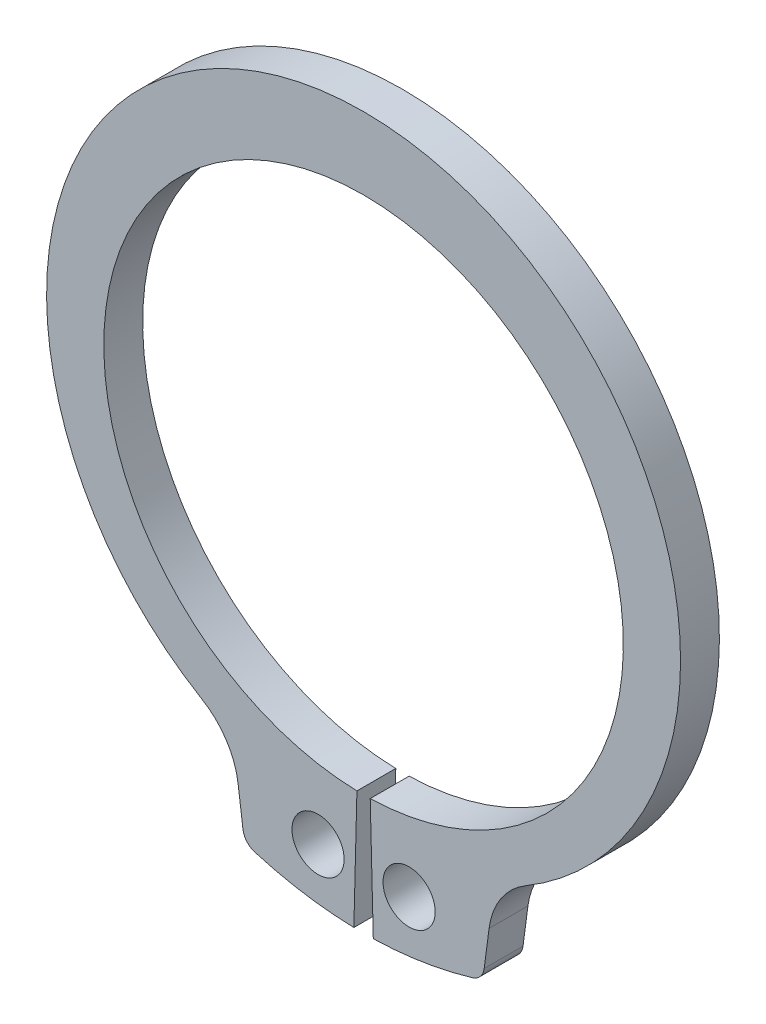
ISO-10303-21;
HEADER;
FILE_DESCRIPTION(('STEP AP214'),'2;1');
FILE_NAME('part.step','',(''),(''),'','','');
FILE_SCHEMA(('AUTOMOTIVE_DESIGN { 1 0 10303 214 1 1 1 1 }'));
ENDSEC;
DATA;
#1=APPLICATION_CONTEXT('core data for automotive mechanical design processes');
#2=APPLICATION_PROTOCOL_DEFINITION('international standard','automotive_design',2000,#1);
#3=PRODUCT_CONTEXT('',#1,'mechanical');
#4=PRODUCT('Part','Part','',(#3));
#5=PRODUCT_RELATED_PRODUCT_CATEGORY('part','',(#4));
#6=PRODUCT_DEFINITION_FORMATION('','',#4);
#7=PRODUCT_DEFINITION_CONTEXT('part definition',#1,'design');
#8=PRODUCT_DEFINITION('design','',#6,#7);
#9=PRODUCT_DEFINITION_SHAPE('','',#8);
#10=(LENGTH_UNIT() NAMED_UNIT(*) SI_UNIT(.MILLI.,.METRE.));
#11=(NAMED_UNIT(*) PLANE_ANGLE_UNIT() SI_UNIT($,.RADIAN.));
#12=(NAMED_UNIT(*) SI_UNIT($,.STERADIAN.) SOLID_ANGLE_UNIT());
#13=UNCERTAINTY_MEASURE_WITH_UNIT(LENGTH_MEASURE(1.E-05),#10,'distance_accuracy_value','');
#14=(GEOMETRIC_REPRESENTATION_CONTEXT(3) GLOBAL_UNCERTAINTY_ASSIGNED_CONTEXT((#13)) GLOBAL_UNIT_ASSIGNED_CONTEXT((#10,
#11,#12)) REPRESENTATION_CONTEXT('',''));
#15=CARTESIAN_POINT('',(0.,0.,0.));
#16=DIRECTION('',(0.,0.,1.));
#17=DIRECTION('',(1.,0.,0.));
#18=AXIS2_PLACEMENT_3D('',#15,#16,#17);
#19=CARTESIAN_POINT('',(0.,0.,0.889));
#20=DIRECTION('',(0.,0.,1.));
#21=DIRECTION('',(1.,0.,0.));
#22=AXIS2_PLACEMENT_3D('',#19,#20,#21);
#23=PLANE('',#22);
#24=CARTESIAN_POINT('',(1.0414,-7.4459267119681,0.889));
#25=DIRECTION('',(0.,0.,1.));
#26=DIRECTION('',(1.,0.,0.));
#27=AXIS2_PLACEMENT_3D('',#24,#25,#26);
#28=CIRCLE('',#27,0.5969);
#29=CARTESIAN_POINT('',(1.6383,-7.4459267119681,0.889));
#30=VERTEX_POINT('',#29);
#31=EDGE_CURVE('E159',#30,#30,#28,.T.);
#32=ORIENTED_EDGE('',*,*,#31,.F.);
#33=EDGE_LOOP('',(#32));
#34=FACE_BOUND('',#33,.T.);
#35=CARTESIAN_POINT('',(0.,0.,0.889));
#36=DIRECTION('',(0.,0.,-1.));
#37=DIRECTION('',(1.,0.,0.));
#38=AXIS2_PLACEMENT_3D('',#35,#36,#37);
#39=CIRCLE('',#38,5.9436);
#40=CARTESIAN_POINT('',(-0.152065789473684,-5.94165439550903,0.889));
#41=VERTEX_POINT('',#40);
#42=CARTESIAN_POINT('',(0.152065789473684,-5.94165439550903,0.889));
#43=VERTEX_POINT('',#42);
#44=EDGE_CURVE('E178',#41,#43,#39,.T.);
#45=ORIENTED_EDGE('',*,*,#44,.T.);
#46=DIRECTION('',(0.0255847953216374,-0.999672655546979,0.));
#47=VECTOR('',#46,1.);
#48=CARTESIAN_POINT('',(0.152065789473684,-5.94165439550903,0.889));
#49=LINE('',#48,#47);
#50=CARTESIAN_POINT('',(0.22225,-8.6839564242055,0.889));
#51=VERTEX_POINT('',#50);
#52=EDGE_CURVE('E106',#43,#51,#49,.T.);
#53=ORIENTED_EDGE('',*,*,#52,.T.);
#54=CARTESIAN_POINT('',(0.,0.,0.889));
#55=DIRECTION('',(0.,0.,1.));
#56=DIRECTION('',(1.,0.,0.));
#57=AXIS2_PLACEMENT_3D('',#54,#55,#56);
#58=CIRCLE('',#57,8.6868);
#59=CARTESIAN_POINT('',(2.49086219116565,-8.32202498101403,0.889));
#60=VERTEX_POINT('',#59);
#61=EDGE_CURVE('E205',#51,#60,#58,.T.);
#62=ORIENTED_EDGE('',*,*,#61,.T.);
#63=CARTESIAN_POINT('',(2.38161384944786,-7.95702388535552,0.889));
#64=DIRECTION('',(0.,0.,1.));
#65=DIRECTION('',(-1.,0.,0.));
#66=AXIS2_PLACEMENT_3D('',#63,#64,#65);
#67=CIRCLE('',#66,0.381000000000001);
#68=CARTESIAN_POINT('',(2.75935434163128,-8.00675436459136,0.889));
#69=VERTEX_POINT('',#68);
#70=EDGE_CURVE('E224',#60,#69,#67,.T.);
#71=ORIENTED_EDGE('',*,*,#70,.T.);
#72=DIRECTION('',(0.13052619222005,0.991444861373811,0.));
#73=VECTOR('',#72,1.);
#74=CARTESIAN_POINT('',(2.8716645271745,-7.15367381085051,0.889));
#75=LINE('',#74,#73);
#76=CARTESIAN_POINT('',(2.8716645271745,-7.15367381085051,0.889));
#77=VERTEX_POINT('',#76);
#78=EDGE_CURVE('E221',#69,#77,#75,.T.);
#79=ORIENTED_EDGE('',*,*,#78,.T.);
#80=CARTESIAN_POINT('',(4.58365954585021,-7.37906223091635,0.889));
#81=DIRECTION('',(0.,0.,-1.));
#82=DIRECTION('',(1.,0.,0.));
#83=AXIS2_PLACEMENT_3D('',#80,#81,#82);
#84=CIRCLE('',#83,1.72676775620528);
#85=CARTESIAN_POINT('',(3.70219111423797,-5.89422544259877,0.889));
#86=VERTEX_POINT('',#85);
#87=EDGE_CURVE('E223',#77,#86,#84,.T.);
#88=ORIENTED_EDGE('',*,*,#87,.T.);
#89=CARTESIAN_POINT('',(0.,0.342128993541952,0.889));
#90=DIRECTION('',(0.,0.,1.));
#91=DIRECTION('',(1.,0.,0.));
#92=AXIS2_PLACEMENT_3D('',#89,#90,#91);
#93=CIRCLE('',#92,7.25247100645805);
#94=CARTESIAN_POINT('',(-3.70219111423797,-5.89422544259877,0.889));
#95=VERTEX_POINT('',#94);
#96=EDGE_CURVE('E226',#86,#95,#93,.T.);
#97=ORIENTED_EDGE('',*,*,#96,.T.);
#98=CARTESIAN_POINT('',(-4.58365954585021,-7.37906223091635,0.889));
#99=DIRECTION('',(0.,0.,-1.));
#100=DIRECTION('',(1.,0.,0.));
#101=AXIS2_PLACEMENT_3D('',#98,#99,#100);
#102=CIRCLE('',#101,1.72676775620528);
#103=CARTESIAN_POINT('',(-2.8716645271745,-7.15367381085051,0.889));
#104=VERTEX_POINT('',#103);
#105=EDGE_CURVE('E232',#95,#104,#102,.T.);
#106=ORIENTED_EDGE('',*,*,#105,.T.);
#107=DIRECTION('',(0.13052619222005,-0.991444861373811,0.));
#108=VECTOR('',#107,1.);
#109=CARTESIAN_POINT('',(-2.8716645271745,-7.15367381085051,0.889));
#110=LINE('',#109,#108);
#111=CARTESIAN_POINT('',(-2.75935434163128,-8.00675436459136,0.889));
#112=VERTEX_POINT('',#111);
#113=EDGE_CURVE('E137',#104,#112,#110,.T.);
#114=ORIENTED_EDGE('',*,*,#113,.T.);
#115=CARTESIAN_POINT('',(-2.38161384944786,-7.95702388535552,0.889));
#116=DIRECTION('',(0.,0.,1.));
#117=DIRECTION('',(1.,0.,0.));
#118=AXIS2_PLACEMENT_3D('',#115,#116,#117);
#119=CIRCLE('',#118,0.381000000000001);
#120=CARTESIAN_POINT('',(-2.49086219116565,-8.32202498101402,0.889));
#121=VERTEX_POINT('',#120);
#122=EDGE_CURVE('E131',#112,#121,#119,.T.);
#123=ORIENTED_EDGE('',*,*,#122,.T.);
#124=CARTESIAN_POINT('',(0.,0.,0.889));
#125=DIRECTION('',(0.,0.,1.));
#126=DIRECTION('',(1.,0.,0.));
#127=AXIS2_PLACEMENT_3D('',#124,#125,#126);
#128=CIRCLE('',#127,8.6868);
#129=CARTESIAN_POINT('',(-0.22225,-8.6839564242055,0.889));
#130=VERTEX_POINT('',#129);
#131=EDGE_CURVE('E135',#121,#130,#128,.T.);
#132=ORIENTED_EDGE('',*,*,#131,.T.);
#133=DIRECTION('',(0.0255847953216374,0.999672655546979,0.));
#134=VECTOR('',#133,1.);
#135=CARTESIAN_POINT('',(-0.152065789473684,-5.94165439550903,0.889));
#136=LINE('',#135,#134);
#137=EDGE_CURVE('E51',#130,#41,#136,.T.);
#138=ORIENTED_EDGE('',*,*,#137,.T.);
#139=EDGE_LOOP('',(#45,#53,#62,#71,#79,#88,#97,#106,#114,#123,#132,#138));
#140=FACE_BOUND('',#139,.T.);
#141=CARTESIAN_POINT('',(-1.0414,-7.4459267119681,0.889));
#142=DIRECTION('',(0.,0.,1.));
#143=DIRECTION('',(1.,0.,0.));
#144=AXIS2_PLACEMENT_3D('',#141,#142,#143);
#145=CIRCLE('',#144,0.5969);
#146=CARTESIAN_POINT('',(-0.4445,-7.4459267119681,0.889));
#147=VERTEX_POINT('',#146);
#148=EDGE_CURVE('E274',#147,#147,#145,.T.);
#149=ORIENTED_EDGE('',*,*,#148,.F.);
#150=EDGE_LOOP('',(#149));
#151=FACE_BOUND('',#150,.T.);
#152=ADVANCED_FACE('F34',(#34,#140,#151),#23,.T.);
#153=CARTESIAN_POINT('',(0.,0.,0.));
#154=DIRECTION('',(0.,0.,1.));
#155=DIRECTION('',(1.,0.,0.));
#156=AXIS2_PLACEMENT_3D('',#153,#154,#155);
#157=PLANE('',#156);
#158=CARTESIAN_POINT('',(0.,0.,0.));
#159=DIRECTION('',(0.,0.,-1.));
#160=DIRECTION('',(1.,0.,0.));
#161=AXIS2_PLACEMENT_3D('',#158,#159,#160);
#162=CIRCLE('',#161,5.9436);
#163=CARTESIAN_POINT('',(-0.152065789473684,-5.94165439550903,0.));
#164=VERTEX_POINT('',#163);
#165=CARTESIAN_POINT('',(0.152065789473684,-5.94165439550903,0.));
#166=VERTEX_POINT('',#165);
#167=EDGE_CURVE('E155',#164,#166,#162,.T.);
#168=ORIENTED_EDGE('',*,*,#167,.F.);
#169=DIRECTION('',(0.0255847953216374,0.999672655546979,0.));
#170=VECTOR('',#169,1.);
#171=CARTESIAN_POINT('',(-0.152065789473684,-5.94165439550903,0.));
#172=LINE('',#171,#170);
#173=CARTESIAN_POINT('',(-0.22225,-8.6839564242055,0.));
#174=VERTEX_POINT('',#173);
#175=EDGE_CURVE('E98',#174,#164,#172,.T.);
#176=ORIENTED_EDGE('',*,*,#175,.F.);
#177=CARTESIAN_POINT('',(0.,0.,0.));
#178=DIRECTION('',(0.,0.,1.));
#179=DIRECTION('',(1.,0.,0.));
#180=AXIS2_PLACEMENT_3D('',#177,#178,#179);
#181=CIRCLE('',#180,8.6868);
#182=CARTESIAN_POINT('',(-2.49086219116565,-8.32202498101402,0.));
#183=VERTEX_POINT('',#182);
#184=EDGE_CURVE('E92',#183,#174,#181,.T.);
#185=ORIENTED_EDGE('',*,*,#184,.F.);
#186=CARTESIAN_POINT('',(-2.38161384944786,-7.95702388535552,0.));
#187=DIRECTION('',(0.,0.,1.));
#188=DIRECTION('',(1.,0.,0.));
#189=AXIS2_PLACEMENT_3D('',#186,#187,#188);
#190=CIRCLE('',#189,0.381000000000001);
#191=CARTESIAN_POINT('',(-2.75935434163128,-8.00675436459136,0.));
#192=VERTEX_POINT('',#191);
#193=EDGE_CURVE('E145',#192,#183,#190,.T.);
#194=ORIENTED_EDGE('',*,*,#193,.F.);
#195=DIRECTION('',(0.13052619222005,-0.991444861373811,0.));
#196=VECTOR('',#195,1.);
#197=CARTESIAN_POINT('',(-2.8716645271745,-7.15367381085051,0.));
#198=LINE('',#197,#196);
#199=CARTESIAN_POINT('',(-2.8716645271745,-7.15367381085051,0.));
#200=VERTEX_POINT('',#199);
#201=EDGE_CURVE('E173',#200,#192,#198,.T.);
#202=ORIENTED_EDGE('',*,*,#201,.F.);
#203=CARTESIAN_POINT('',(-4.58365954585021,-7.37906223091635,0.));
#204=DIRECTION('',(0.,0.,-1.));
#205=DIRECTION('',(1.,0.,0.));
#206=AXIS2_PLACEMENT_3D('',#203,#204,#205);
#207=CIRCLE('',#206,1.72676775620528);
#208=CARTESIAN_POINT('',(-3.70219111423797,-5.89422544259877,0.));
#209=VERTEX_POINT('',#208);
#210=EDGE_CURVE('E171',#209,#200,#207,.T.);
#211=ORIENTED_EDGE('',*,*,#210,.F.);
#212=CARTESIAN_POINT('',(0.,0.342128993541952,0.));
#213=DIRECTION('',(0.,0.,1.));
#214=DIRECTION('',(1.,0.,0.));
#215=AXIS2_PLACEMENT_3D('',#212,#213,#214);
#216=CIRCLE('',#215,7.25247100645805);
#217=CARTESIAN_POINT('',(3.70219111423797,-5.89422544259877,0.));
#218=VERTEX_POINT('',#217);
#219=EDGE_CURVE('E169',#218,#209,#216,.T.);
#220=ORIENTED_EDGE('',*,*,#219,.F.);
#221=CARTESIAN_POINT('',(4.58365954585021,-7.37906223091635,0.));
#222=DIRECTION('',(0.,0.,-1.));
#223=DIRECTION('',(1.,0.,0.));
#224=AXIS2_PLACEMENT_3D('',#221,#222,#223);
#225=CIRCLE('',#224,1.72676775620528);
#226=CARTESIAN_POINT('',(2.8716645271745,-7.15367381085051,0.));
#227=VERTEX_POINT('',#226);
#228=EDGE_CURVE('E167',#227,#218,#225,.T.);
#229=ORIENTED_EDGE('',*,*,#228,.F.);
#230=DIRECTION('',(0.13052619222005,0.991444861373811,0.));
#231=VECTOR('',#230,1.);
#232=CARTESIAN_POINT('',(2.8716645271745,-7.15367381085051,0.));
#233=LINE('',#232,#231);
#234=CARTESIAN_POINT('',(2.75935434163128,-8.00675436459136,0.));
#235=VERTEX_POINT('',#234);
#236=EDGE_CURVE('E165',#235,#227,#233,.T.);
#237=ORIENTED_EDGE('',*,*,#236,.F.);
#238=CARTESIAN_POINT('',(2.38161384944786,-7.95702388535552,0.));
#239=DIRECTION('',(0.,0.,1.));
#240=DIRECTION('',(-1.,0.,0.));
#241=AXIS2_PLACEMENT_3D('',#238,#239,#240);
#242=CIRCLE('',#241,0.381000000000001);
#243=CARTESIAN_POINT('',(2.49086219116565,-8.32202498101403,0.));
#244=VERTEX_POINT('',#243);
#245=EDGE_CURVE('E163',#244,#235,#242,.T.);
#246=ORIENTED_EDGE('',*,*,#245,.F.);
#247=CARTESIAN_POINT('',(0.,0.,0.));
#248=DIRECTION('',(0.,0.,1.));
#249=DIRECTION('',(1.,0.,0.));
#250=AXIS2_PLACEMENT_3D('',#247,#248,#249);
#251=CIRCLE('',#250,8.6868);
#252=CARTESIAN_POINT('',(0.22225,-8.6839564242055,0.));
#253=VERTEX_POINT('',#252);
#254=EDGE_CURVE('E161',#253,#244,#251,.T.);
#255=ORIENTED_EDGE('',*,*,#254,.F.);
#256=DIRECTION('',(0.0255847953216374,-0.999672655546979,0.));
#257=VECTOR('',#256,1.);
#258=CARTESIAN_POINT('',(0.152065789473684,-5.94165439550903,0.));
#259=LINE('',#258,#257);
#260=EDGE_CURVE('E158',#166,#253,#259,.T.);
#261=ORIENTED_EDGE('',*,*,#260,.F.);
#262=EDGE_LOOP('',(#168,#176,#185,#194,#202,#211,#220,#229,#237,#246,#255,#261));
#263=FACE_BOUND('',#262,.T.);
#264=CARTESIAN_POINT('',(1.0414,-7.4459267119681,0.));
#265=DIRECTION('',(0.,0.,1.));
#266=DIRECTION('',(1.,0.,0.));
#267=AXIS2_PLACEMENT_3D('',#264,#265,#266);
#268=CIRCLE('',#267,0.5969);
#269=CARTESIAN_POINT('',(1.6383,-7.4459267119681,0.));
#270=VERTEX_POINT('',#269);
#271=EDGE_CURVE('E280',#270,#270,#268,.T.);
#272=ORIENTED_EDGE('',*,*,#271,.T.);
#273=EDGE_LOOP('',(#272));
#274=FACE_BOUND('',#273,.T.);
#275=CARTESIAN_POINT('',(-1.0414,-7.4459267119681,0.));
#276=DIRECTION('',(0.,0.,1.));
#277=DIRECTION('',(1.,0.,0.));
#278=AXIS2_PLACEMENT_3D('',#275,#276,#277);
#279=CIRCLE('',#278,0.5969);
#280=CARTESIAN_POINT('',(-0.4445,-7.4459267119681,0.));
#281=VERTEX_POINT('',#280);
#282=EDGE_CURVE('E277',#281,#281,#279,.T.);
#283=ORIENTED_EDGE('',*,*,#282,.T.);
#284=EDGE_LOOP('',(#283));
#285=FACE_BOUND('',#284,.T.);
#286=ADVANCED_FACE('F209',(#263,#274,#285),#157,.F.);
#287=CARTESIAN_POINT('',(0.,0.,0.889));
#288=DIRECTION('',(0.,0.,-1.));
#289=DIRECTION('',(-1.,0.,0.));
#290=AXIS2_PLACEMENT_3D('',#287,#288,#289);
#291=CYLINDRICAL_SURFACE('',#290,5.9436);
#292=ORIENTED_EDGE('',*,*,#167,.T.);
#293=DIRECTION('',(0.,0.,-1.));
#294=VECTOR('',#293,1.);
#295=CARTESIAN_POINT('',(0.152065789473684,-5.94165439550903,0.889));
#296=LINE('',#295,#294);
#297=EDGE_CURVE('E11',#43,#166,#296,.T.);
#298=ORIENTED_EDGE('',*,*,#297,.F.);
#299=ORIENTED_EDGE('',*,*,#44,.F.);
#300=DIRECTION('',(0.,0.,-1.));
#301=VECTOR('',#300,1.);
#302=CARTESIAN_POINT('',(-0.152065789473684,-5.94165439550903,0.889));
#303=LINE('',#302,#301);
#304=EDGE_CURVE('E151',#41,#164,#303,.T.);
#305=ORIENTED_EDGE('',*,*,#304,.T.);
#306=EDGE_LOOP('',(#292,#298,#299,#305));
#307=FACE_BOUND('',#306,.T.);
#308=ADVANCED_FACE('F36',(#307),#291,.F.);
#309=CARTESIAN_POINT('',(0.152065789473684,-5.94165439550903,0.889));
#310=DIRECTION('',(0.999672655546979,0.0255847953216374,0.));
#311=DIRECTION('',(-0.0255847953216374,0.999672655546979,0.));
#312=AXIS2_PLACEMENT_3D('',#309,#310,#311);
#313=PLANE('',#312);
#314=ORIENTED_EDGE('',*,*,#260,.T.);
#315=DIRECTION('',(0.,0.,-1.));
#316=VECTOR('',#315,1.);
#317=CARTESIAN_POINT('',(0.22225,-8.6839564242055,0.889));
#318=LINE('',#317,#316);
#319=EDGE_CURVE('E43',#51,#253,#318,.T.);
#320=ORIENTED_EDGE('',*,*,#319,.F.);
#321=ORIENTED_EDGE('',*,*,#52,.F.);
#322=ORIENTED_EDGE('',*,*,#297,.T.);
#323=EDGE_LOOP('',(#314,#320,#321,#322));
#324=FACE_BOUND('',#323,.T.);
#325=ADVANCED_FACE('F373',(#324),#313,.F.);
#326=CARTESIAN_POINT('',(0.,0.,0.889));
#327=DIRECTION('',(0.,0.,-1.));
#328=DIRECTION('',(-1.,0.,0.));
#329=AXIS2_PLACEMENT_3D('',#326,#327,#328);
#330=CYLINDRICAL_SURFACE('',#329,8.6868);
#331=ORIENTED_EDGE('',*,*,#254,.T.);
#332=DIRECTION('',(0.,0.,-1.));
#333=VECTOR('',#332,1.);
#334=CARTESIAN_POINT('',(2.49086219116565,-8.32202498101403,0.889));
#335=LINE('',#334,#333);
#336=EDGE_CURVE('E197',#60,#244,#335,.T.);
#337=ORIENTED_EDGE('',*,*,#336,.F.);
#338=ORIENTED_EDGE('',*,*,#61,.F.);
#339=ORIENTED_EDGE('',*,*,#319,.T.);
#340=EDGE_LOOP('',(#331,#337,#338,#339));
#341=FACE_BOUND('',#340,.T.);
#342=ADVANCED_FACE('F203',(#341),#330,.T.);
#343=CARTESIAN_POINT('',(2.38161384944786,-7.95702388535552,0.889));
#344=DIRECTION('',(0.,0.,-1.));
#345=DIRECTION('',(-1.,0.,0.));
#346=AXIS2_PLACEMENT_3D('',#343,#344,#345);
#347=CYLINDRICAL_SURFACE('',#346,0.381000000000001);
#348=ORIENTED_EDGE('',*,*,#245,.T.);
#349=DIRECTION('',(0.,0.,-1.));
#350=VECTOR('',#349,1.);
#351=CARTESIAN_POINT('',(2.75935434163128,-8.00675436459136,0.889));
#352=LINE('',#351,#350);
#353=EDGE_CURVE('E194',#69,#235,#352,.T.);
#354=ORIENTED_EDGE('',*,*,#353,.F.);
#355=ORIENTED_EDGE('',*,*,#70,.F.);
#356=ORIENTED_EDGE('',*,*,#336,.T.);
#357=EDGE_LOOP('',(#348,#354,#355,#356));
#358=FACE_BOUND('',#357,.T.);
#359=ADVANCED_FACE('F215',(#358),#347,.T.);
#360=CARTESIAN_POINT('',(2.8716645271745,-7.15367381085051,0.889));
#361=DIRECTION('',(-0.991444861373811,0.13052619222005,0.));
#362=DIRECTION('',(-0.13052619222005,-0.991444861373811,0.));
#363=AXIS2_PLACEMENT_3D('',#360,#361,#362);
#364=PLANE('',#363);
#365=ORIENTED_EDGE('',*,*,#236,.T.);
#366=DIRECTION('',(0.,0.,-1.));
#367=VECTOR('',#366,1.);
#368=CARTESIAN_POINT('',(2.8716645271745,-7.15367381085051,0.889));
#369=LINE('',#368,#367);
#370=EDGE_CURVE('E191',#77,#227,#369,.T.);
#371=ORIENTED_EDGE('',*,*,#370,.F.);
#372=ORIENTED_EDGE('',*,*,#78,.F.);
#373=ORIENTED_EDGE('',*,*,#353,.T.);
#374=EDGE_LOOP('',(#365,#371,#372,#373));
#375=FACE_BOUND('',#374,.T.);
#376=ADVANCED_FACE('F219',(#375),#364,.F.);
#377=CARTESIAN_POINT('',(4.58365954585021,-7.37906223091635,0.889));
#378=DIRECTION('',(0.,0.,-1.));
#379=DIRECTION('',(-1.,0.,0.));
#380=AXIS2_PLACEMENT_3D('',#377,#378,#379);
#381=CYLINDRICAL_SURFACE('',#380,1.72676775620528);
#382=ORIENTED_EDGE('',*,*,#228,.T.);
#383=DIRECTION('',(0.,0.,-1.));
#384=VECTOR('',#383,1.);
#385=CARTESIAN_POINT('',(3.70219111423797,-5.89422544259877,0.889));
#386=LINE('',#385,#384);
#387=EDGE_CURVE('E188',#86,#218,#386,.T.);
#388=ORIENTED_EDGE('',*,*,#387,.F.);
#389=ORIENTED_EDGE('',*,*,#87,.F.);
#390=ORIENTED_EDGE('',*,*,#370,.T.);
#391=EDGE_LOOP('',(#382,#388,#389,#390));
#392=FACE_BOUND('',#391,.T.);
#393=ADVANCED_FACE('F338',(#392),#381,.F.);
#394=CARTESIAN_POINT('',(0.,0.342128993541952,0.889));
#395=DIRECTION('',(0.,0.,-1.));
#396=DIRECTION('',(-1.,0.,0.));
#397=AXIS2_PLACEMENT_3D('',#394,#395,#396);
#398=CYLINDRICAL_SURFACE('',#397,7.25247100645805);
#399=ORIENTED_EDGE('',*,*,#219,.T.);
#400=DIRECTION('',(0.,0.,-1.));
#401=VECTOR('',#400,1.);
#402=CARTESIAN_POINT('',(-3.70219111423797,-5.89422544259877,0.889));
#403=LINE('',#402,#401);
#404=EDGE_CURVE('E185',#95,#209,#403,.T.);
#405=ORIENTED_EDGE('',*,*,#404,.F.);
#406=ORIENTED_EDGE('',*,*,#96,.F.);
#407=ORIENTED_EDGE('',*,*,#387,.T.);
#408=EDGE_LOOP('',(#399,#405,#406,#407));
#409=FACE_BOUND('',#408,.T.);
#410=ADVANCED_FACE('F329',(#409),#398,.T.);
#411=CARTESIAN_POINT('',(-4.58365954585021,-7.37906223091635,0.889));
#412=DIRECTION('',(0.,0.,-1.));
#413=DIRECTION('',(-1.,0.,0.));
#414=AXIS2_PLACEMENT_3D('',#411,#412,#413);
#415=CYLINDRICAL_SURFACE('',#414,1.72676775620528);
#416=ORIENTED_EDGE('',*,*,#210,.T.);
#417=DIRECTION('',(0.,0.,-1.));
#418=VECTOR('',#417,1.);
#419=CARTESIAN_POINT('',(-2.8716645271745,-7.15367381085051,0.889));
#420=LINE('',#419,#418);
#421=EDGE_CURVE('E182',#104,#200,#420,.T.);
#422=ORIENTED_EDGE('',*,*,#421,.F.);
#423=ORIENTED_EDGE('',*,*,#105,.F.);
#424=ORIENTED_EDGE('',*,*,#404,.T.);
#425=EDGE_LOOP('',(#416,#422,#423,#424));
#426=FACE_BOUND('',#425,.T.);
#427=ADVANCED_FACE('F238',(#426),#415,.F.);
#428=CARTESIAN_POINT('',(-2.8716645271745,-7.15367381085051,0.889));
#429=DIRECTION('',(0.991444861373811,0.13052619222005,0.));
#430=DIRECTION('',(-0.13052619222005,0.991444861373811,0.));
#431=AXIS2_PLACEMENT_3D('',#428,#429,#430);
#432=PLANE('',#431);
#433=ORIENTED_EDGE('',*,*,#201,.T.);
#434=DIRECTION('',(0.,0.,-1.));
#435=VECTOR('',#434,1.);
#436=CARTESIAN_POINT('',(-2.75935434163128,-8.00675436459136,0.889));
#437=LINE('',#436,#435);
#438=EDGE_CURVE('E146',#112,#192,#437,.T.);
#439=ORIENTED_EDGE('',*,*,#438,.F.);
#440=ORIENTED_EDGE('',*,*,#113,.F.);
#441=ORIENTED_EDGE('',*,*,#421,.T.);
#442=EDGE_LOOP('',(#433,#439,#440,#441));
#443=FACE_BOUND('',#442,.T.);
#444=ADVANCED_FACE('F242',(#443),#432,.F.);
#445=CARTESIAN_POINT('',(-2.38161384944786,-7.95702388535552,0.889));
#446=DIRECTION('',(0.,0.,-1.));
#447=DIRECTION('',(-1.,0.,0.));
#448=AXIS2_PLACEMENT_3D('',#445,#446,#447);
#449=CYLINDRICAL_SURFACE('',#448,0.381000000000001);
#450=ORIENTED_EDGE('',*,*,#193,.T.);
#451=DIRECTION('',(0.,0.,-1.));
#452=VECTOR('',#451,1.);
#453=CARTESIAN_POINT('',(-2.49086219116565,-8.32202498101402,0.889));
#454=LINE('',#453,#452);
#455=EDGE_CURVE('E142',#121,#183,#454,.T.);
#456=ORIENTED_EDGE('',*,*,#455,.F.);
#457=ORIENTED_EDGE('',*,*,#122,.F.);
#458=ORIENTED_EDGE('',*,*,#438,.T.);
#459=EDGE_LOOP('',(#450,#456,#457,#458));
#460=FACE_BOUND('',#459,.T.);
#461=ADVANCED_FACE('F143',(#460),#449,.T.);
#462=CARTESIAN_POINT('',(0.,0.,0.889));
#463=DIRECTION('',(0.,0.,-1.));
#464=DIRECTION('',(-1.,0.,0.));
#465=AXIS2_PLACEMENT_3D('',#462,#463,#464);
#466=CYLINDRICAL_SURFACE('',#465,8.6868);
#467=ORIENTED_EDGE('',*,*,#184,.T.);
#468=DIRECTION('',(0.,0.,-1.));
#469=VECTOR('',#468,1.);
#470=CARTESIAN_POINT('',(-0.22225,-8.6839564242055,0.889));
#471=LINE('',#470,#469);
#472=EDGE_CURVE('E147',#130,#174,#471,.T.);
#473=ORIENTED_EDGE('',*,*,#472,.F.);
#474=ORIENTED_EDGE('',*,*,#131,.F.);
#475=ORIENTED_EDGE('',*,*,#455,.T.);
#476=EDGE_LOOP('',(#467,#473,#474,#475));
#477=FACE_BOUND('',#476,.T.);
#478=ADVANCED_FACE('F149',(#477),#466,.T.);
#479=CARTESIAN_POINT('',(-0.152065789473684,-5.94165439550903,0.889));
#480=DIRECTION('',(-0.999672655546979,0.0255847953216374,0.));
#481=DIRECTION('',(-0.0255847953216374,-0.999672655546979,0.));
#482=AXIS2_PLACEMENT_3D('',#479,#480,#481);
#483=PLANE('',#482);
#484=ORIENTED_EDGE('',*,*,#175,.T.);
#485=ORIENTED_EDGE('',*,*,#304,.F.);
#486=ORIENTED_EDGE('',*,*,#137,.F.);
#487=ORIENTED_EDGE('',*,*,#472,.T.);
#488=EDGE_LOOP('',(#484,#485,#486,#487));
#489=FACE_BOUND('',#488,.T.);
#490=ADVANCED_FACE('F246',(#489),#483,.F.);
#491=CARTESIAN_POINT('',(1.0414,-7.4459267119681,0.889));
#492=DIRECTION('',(0.,0.,-1.));
#493=DIRECTION('',(-1.,0.,0.));
#494=AXIS2_PLACEMENT_3D('',#491,#492,#493);
#495=CYLINDRICAL_SURFACE('',#494,0.5969);
#496=ORIENTED_EDGE('',*,*,#31,.T.);
#497=EDGE_LOOP('',(#496));
#498=FACE_BOUND('',#497,.T.);
#499=ORIENTED_EDGE('',*,*,#271,.F.);
#500=EDGE_LOOP('',(#499));
#501=FACE_BOUND('',#500,.T.);
#502=ADVANCED_FACE('F248',(#498,#501),#495,.F.);
#503=CARTESIAN_POINT('',(-1.0414,-7.4459267119681,0.889));
#504=DIRECTION('',(0.,0.,-1.));
#505=DIRECTION('',(-1.,0.,0.));
#506=AXIS2_PLACEMENT_3D('',#503,#504,#505);
#507=CYLINDRICAL_SURFACE('',#506,0.5969);
#508=ORIENTED_EDGE('',*,*,#148,.T.);
#509=EDGE_LOOP('',(#508));
#510=FACE_BOUND('',#509,.T.);
#511=ORIENTED_EDGE('',*,*,#282,.F.);
#512=EDGE_LOOP('',(#511));
#513=FACE_BOUND('',#512,.T.);
#514=ADVANCED_FACE('F254',(#510,#513),#507,.F.);
#515=CLOSED_SHELL('',(#152,#286,#308,#325,#342,#359,#376,#393,#410,#427,#444,#461,#478,#490,
#502,#514));
#516=MANIFOLD_SOLID_BREP('B2',#515);
#517=ADVANCED_BREP_SHAPE_REPRESENTATION('',(#18,#516),#14);
#518=SHAPE_DEFINITION_REPRESENTATION(#9,#517);
ENDSEC;
END-ISO-10303-21;
